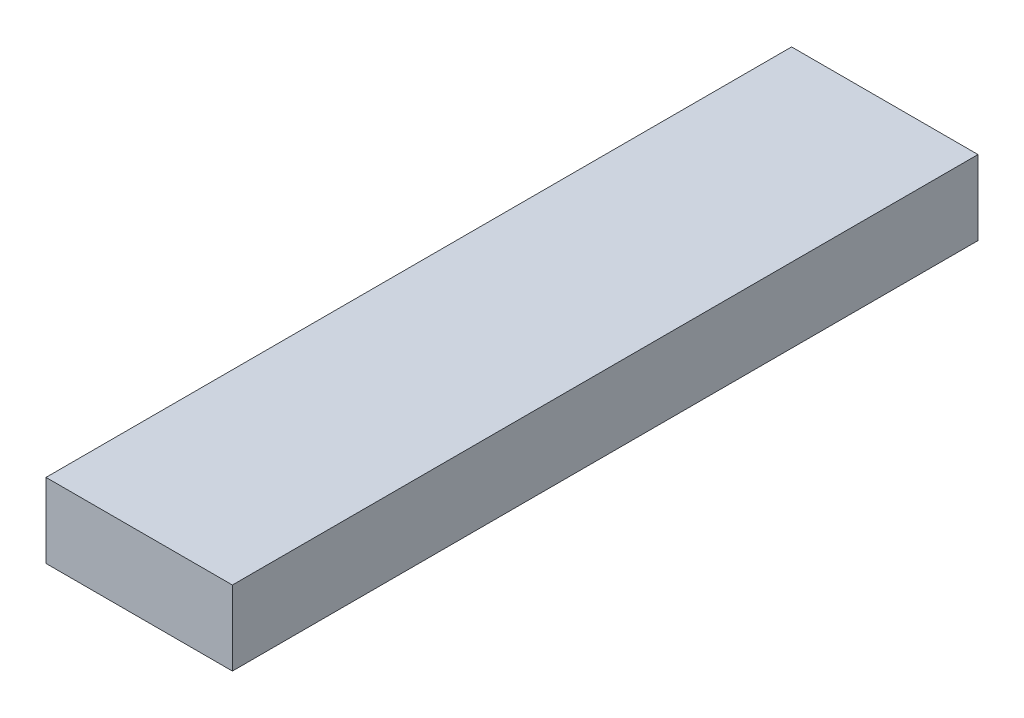
ISO-10303-21;
HEADER;
FILE_DESCRIPTION(('STEP AP214'),'2;1');
FILE_NAME('part.step','',(''),(''),'','','');
FILE_SCHEMA(('AUTOMOTIVE_DESIGN { 1 0 10303 214 1 1 1 1 }'));
ENDSEC;
DATA;
#1=APPLICATION_CONTEXT('core data for automotive mechanical design processes');
#2=APPLICATION_PROTOCOL_DEFINITION('international standard','automotive_design',2000,#1);
#3=PRODUCT_CONTEXT('',#1,'mechanical');
#4=PRODUCT('Part','Part','',(#3));
#5=PRODUCT_RELATED_PRODUCT_CATEGORY('part','',(#4));
#6=PRODUCT_DEFINITION_FORMATION('','',#4);
#7=PRODUCT_DEFINITION_CONTEXT('part definition',#1,'design');
#8=PRODUCT_DEFINITION('design','',#6,#7);
#9=PRODUCT_DEFINITION_SHAPE('','',#8);
#10=(LENGTH_UNIT() NAMED_UNIT(*) SI_UNIT(.MILLI.,.METRE.));
#11=(NAMED_UNIT(*) PLANE_ANGLE_UNIT() SI_UNIT($,.RADIAN.));
#12=(NAMED_UNIT(*) SI_UNIT($,.STERADIAN.) SOLID_ANGLE_UNIT());
#13=UNCERTAINTY_MEASURE_WITH_UNIT(LENGTH_MEASURE(1.E-05),#10,'distance_accuracy_value','');
#14=(GEOMETRIC_REPRESENTATION_CONTEXT(3) GLOBAL_UNCERTAINTY_ASSIGNED_CONTEXT((#13)) GLOBAL_UNIT_ASSIGNED_CONTEXT((#10,
#11,#12)) REPRESENTATION_CONTEXT('',''));
#15=CARTESIAN_POINT('',(0.,0.,0.));
#16=DIRECTION('',(0.,0.,1.));
#17=DIRECTION('',(1.,0.,0.));
#18=AXIS2_PLACEMENT_3D('',#15,#16,#17);
#19=CARTESIAN_POINT('',(0.,1.,0.));
#20=DIRECTION('',(1.,0.,0.));
#21=DIRECTION('',(0.,0.,-1.));
#22=AXIS2_PLACEMENT_3D('',#19,#20,#21);
#23=PLANE('',#22);
#24=DIRECTION('',(0.,0.,1.));
#25=VECTOR('',#24,1.);
#26=CARTESIAN_POINT('',(0.,0.,0.));
#27=LINE('',#26,#25);
#28=CARTESIAN_POINT('',(0.,0.,-10.));
#29=VERTEX_POINT('',#28);
#30=CARTESIAN_POINT('',(0.,0.,0.));
#31=VERTEX_POINT('',#30);
#32=EDGE_CURVE('E101',#29,#31,#27,.T.);
#33=ORIENTED_EDGE('',*,*,#32,.T.);
#34=DIRECTION('',(0.,-1.,0.));
#35=VECTOR('',#34,1.);
#36=CARTESIAN_POINT('',(0.,1.,0.));
#37=LINE('',#36,#35);
#38=CARTESIAN_POINT('',(0.,1.,0.));
#39=VERTEX_POINT('',#38);
#40=EDGE_CURVE('E11',#39,#31,#37,.T.);
#41=ORIENTED_EDGE('',*,*,#40,.F.);
#42=DIRECTION('',(0.,0.,1.));
#43=VECTOR('',#42,1.);
#44=CARTESIAN_POINT('',(0.,1.,0.));
#45=LINE('',#44,#43);
#46=CARTESIAN_POINT('',(0.,1.,-10.));
#47=VERTEX_POINT('',#46);
#48=EDGE_CURVE('E89',#47,#39,#45,.T.);
#49=ORIENTED_EDGE('',*,*,#48,.F.);
#50=DIRECTION('',(0.,-1.,0.));
#51=VECTOR('',#50,1.);
#52=CARTESIAN_POINT('',(0.,1.,-10.));
#53=LINE('',#52,#51);
#54=EDGE_CURVE('E97',#47,#29,#53,.T.);
#55=ORIENTED_EDGE('',*,*,#54,.T.);
#56=EDGE_LOOP('',(#33,#41,#49,#55));
#57=FACE_BOUND('',#56,.T.);
#58=ADVANCED_FACE('F38',(#57),#23,.F.);
#59=CARTESIAN_POINT('',(0.,1.,0.));
#60=DIRECTION('',(0.,0.,-1.));
#61=DIRECTION('',(-1.,0.,0.));
#62=AXIS2_PLACEMENT_3D('',#59,#60,#61);
#63=PLANE('',#62);
#64=DIRECTION('',(1.,0.,0.));
#65=VECTOR('',#64,1.);
#66=CARTESIAN_POINT('',(0.,0.,0.));
#67=LINE('',#66,#65);
#68=CARTESIAN_POINT('',(2.5,0.,0.));
#69=VERTEX_POINT('',#68);
#70=EDGE_CURVE('E93',#31,#69,#67,.T.);
#71=ORIENTED_EDGE('',*,*,#70,.T.);
#72=DIRECTION('',(0.,-1.,0.));
#73=VECTOR('',#72,1.);
#74=CARTESIAN_POINT('',(2.5,1.,0.));
#75=LINE('',#74,#73);
#76=CARTESIAN_POINT('',(2.5,1.,0.));
#77=VERTEX_POINT('',#76);
#78=EDGE_CURVE('E46',#77,#69,#75,.T.);
#79=ORIENTED_EDGE('',*,*,#78,.F.);
#80=DIRECTION('',(1.,0.,0.));
#81=VECTOR('',#80,1.);
#82=CARTESIAN_POINT('',(0.,1.,0.));
#83=LINE('',#82,#81);
#84=EDGE_CURVE('E84',#39,#77,#83,.T.);
#85=ORIENTED_EDGE('',*,*,#84,.F.);
#86=ORIENTED_EDGE('',*,*,#40,.T.);
#87=EDGE_LOOP('',(#71,#79,#85,#86));
#88=FACE_BOUND('',#87,.T.);
#89=ADVANCED_FACE('F92',(#88),#63,.F.);
#90=CARTESIAN_POINT('',(2.5,1.,0.));
#91=DIRECTION('',(-1.,0.,0.));
#92=DIRECTION('',(0.,0.,1.));
#93=AXIS2_PLACEMENT_3D('',#90,#91,#92);
#94=PLANE('',#93);
#95=DIRECTION('',(0.,0.,-1.));
#96=VECTOR('',#95,1.);
#97=CARTESIAN_POINT('',(2.5,0.,0.));
#98=LINE('',#97,#96);
#99=CARTESIAN_POINT('',(2.5,0.,-10.));
#100=VERTEX_POINT('',#99);
#101=EDGE_CURVE('E71',#69,#100,#98,.T.);
#102=ORIENTED_EDGE('',*,*,#101,.T.);
#103=DIRECTION('',(0.,-1.,0.));
#104=VECTOR('',#103,1.);
#105=CARTESIAN_POINT('',(2.5,1.,-10.));
#106=LINE('',#105,#104);
#107=CARTESIAN_POINT('',(2.5,1.,-10.));
#108=VERTEX_POINT('',#107);
#109=EDGE_CURVE('E94',#108,#100,#106,.T.);
#110=ORIENTED_EDGE('',*,*,#109,.F.);
#111=DIRECTION('',(0.,0.,-1.));
#112=VECTOR('',#111,1.);
#113=CARTESIAN_POINT('',(2.5,1.,0.));
#114=LINE('',#113,#112);
#115=EDGE_CURVE('E87',#77,#108,#114,.T.);
#116=ORIENTED_EDGE('',*,*,#115,.F.);
#117=ORIENTED_EDGE('',*,*,#78,.T.);
#118=EDGE_LOOP('',(#102,#110,#116,#117));
#119=FACE_BOUND('',#118,.T.);
#120=ADVANCED_FACE('F95',(#119),#94,.F.);
#121=CARTESIAN_POINT('',(0.,1.,-10.));
#122=DIRECTION('',(0.,0.,1.));
#123=DIRECTION('',(1.,0.,0.));
#124=AXIS2_PLACEMENT_3D('',#121,#122,#123);
#125=PLANE('',#124);
#126=DIRECTION('',(-1.,0.,0.));
#127=VECTOR('',#126,1.);
#128=CARTESIAN_POINT('',(0.,0.,-10.));
#129=LINE('',#128,#127);
#130=EDGE_CURVE('E77',#100,#29,#129,.T.);
#131=ORIENTED_EDGE('',*,*,#130,.T.);
#132=ORIENTED_EDGE('',*,*,#54,.F.);
#133=DIRECTION('',(-1.,0.,0.));
#134=VECTOR('',#133,1.);
#135=CARTESIAN_POINT('',(0.,1.,-10.));
#136=LINE('',#135,#134);
#137=EDGE_CURVE('E54',#108,#47,#136,.T.);
#138=ORIENTED_EDGE('',*,*,#137,.F.);
#139=ORIENTED_EDGE('',*,*,#109,.T.);
#140=EDGE_LOOP('',(#131,#132,#138,#139));
#141=FACE_BOUND('',#140,.T.);
#142=ADVANCED_FACE('F108',(#141),#125,.F.);
#143=CARTESIAN_POINT('',(0.,1.,0.));
#144=DIRECTION('',(0.,-1.,0.));
#145=DIRECTION('',(0.,0.,-1.));
#146=AXIS2_PLACEMENT_3D('',#143,#144,#145);
#147=PLANE('',#146);
#148=ORIENTED_EDGE('',*,*,#48,.T.);
#149=ORIENTED_EDGE('',*,*,#84,.T.);
#150=ORIENTED_EDGE('',*,*,#115,.T.);
#151=ORIENTED_EDGE('',*,*,#137,.T.);
#152=EDGE_LOOP('',(#148,#149,#150,#151));
#153=FACE_BOUND('',#152,.T.);
#154=ADVANCED_FACE('F85',(#153),#147,.F.);
#155=CARTESIAN_POINT('',(0.,0.,0.));
#156=DIRECTION('',(0.,-1.,0.));
#157=DIRECTION('',(0.,0.,-1.));
#158=AXIS2_PLACEMENT_3D('',#155,#156,#157);
#159=PLANE('',#158);
#160=ORIENTED_EDGE('',*,*,#32,.F.);
#161=ORIENTED_EDGE('',*,*,#130,.F.);
#162=ORIENTED_EDGE('',*,*,#101,.F.);
#163=ORIENTED_EDGE('',*,*,#70,.F.);
#164=EDGE_LOOP('',(#160,#161,#162,#163));
#165=FACE_BOUND('',#164,.T.);
#166=ADVANCED_FACE('F111',(#165),#159,.T.);
#167=CLOSED_SHELL('',(#58,#89,#120,#142,#154,#166));
#168=MANIFOLD_SOLID_BREP('B2',#167);
#169=ADVANCED_BREP_SHAPE_REPRESENTATION('',(#18,#168),#14);
#170=SHAPE_DEFINITION_REPRESENTATION(#9,#169);
ENDSEC;
END-ISO-10303-21;
